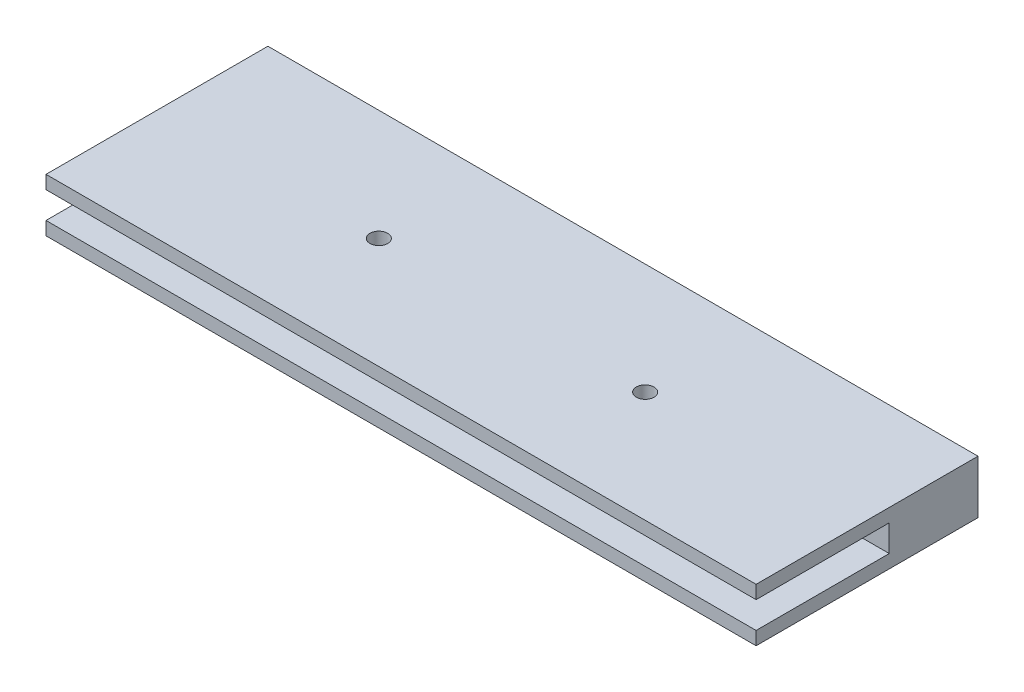
ISO-10303-21;
HEADER;
FILE_DESCRIPTION(('STEP AP214'),'2;1');
FILE_NAME('part.step','',(''),(''),'','','');
FILE_SCHEMA(('AUTOMOTIVE_DESIGN { 1 0 10303 214 1 1 1 1 }'));
ENDSEC;
DATA;
#1=APPLICATION_CONTEXT('core data for automotive mechanical design processes');
#2=APPLICATION_PROTOCOL_DEFINITION('international standard','automotive_design',2000,#1);
#3=PRODUCT_CONTEXT('',#1,'mechanical');
#4=PRODUCT('Part','Part','',(#3));
#5=PRODUCT_RELATED_PRODUCT_CATEGORY('part','',(#4));
#6=PRODUCT_DEFINITION_FORMATION('','',#4);
#7=PRODUCT_DEFINITION_CONTEXT('part definition',#1,'design');
#8=PRODUCT_DEFINITION('design','',#6,#7);
#9=PRODUCT_DEFINITION_SHAPE('','',#8);
#10=(LENGTH_UNIT() NAMED_UNIT(*) SI_UNIT(.MILLI.,.METRE.));
#11=(NAMED_UNIT(*) PLANE_ANGLE_UNIT() SI_UNIT($,.RADIAN.));
#12=(NAMED_UNIT(*) SI_UNIT($,.STERADIAN.) SOLID_ANGLE_UNIT());
#13=UNCERTAINTY_MEASURE_WITH_UNIT(LENGTH_MEASURE(1.E-05),#10,'distance_accuracy_value','');
#14=(GEOMETRIC_REPRESENTATION_CONTEXT(3) GLOBAL_UNCERTAINTY_ASSIGNED_CONTEXT((#13)) GLOBAL_UNIT_ASSIGNED_CONTEXT((#10,
#11,#12)) REPRESENTATION_CONTEXT('',''));
#15=CARTESIAN_POINT('',(0.,0.,0.));
#16=DIRECTION('',(0.,0.,1.));
#17=DIRECTION('',(1.,0.,0.));
#18=AXIS2_PLACEMENT_3D('',#15,#16,#17);
#19=CARTESIAN_POINT('',(60.,-19.,17.5));
#20=DIRECTION('',(0.,1.,0.));
#21=DIRECTION('',(0.,0.,1.));
#22=AXIS2_PLACEMENT_3D('',#19,#20,#21);
#23=CYLINDRICAL_SURFACE('',#22,0.999999999999998);
#24=CARTESIAN_POINT('',(60.,1.5,17.5));
#25=DIRECTION('',(0.,-1.,0.));
#26=DIRECTION('',(0.,0.,-1.));
#27=AXIS2_PLACEMENT_3D('',#24,#25,#26);
#28=CIRCLE('',#27,0.999999999999998);
#29=CARTESIAN_POINT('',(60.,1.5,16.5));
#30=VERTEX_POINT('',#29);
#31=EDGE_CURVE('E210',#30,#30,#28,.T.);
#32=ORIENTED_EDGE('',*,*,#31,.F.);
#33=EDGE_LOOP('',(#32));
#34=FACE_BOUND('',#33,.T.);
#35=CARTESIAN_POINT('',(60.,1.,17.5));
#36=DIRECTION('',(0.,-1.,0.));
#37=DIRECTION('',(0.,0.,-1.));
#38=AXIS2_PLACEMENT_3D('',#35,#36,#37);
#39=CIRCLE('',#38,0.999999999999998);
#40=CARTESIAN_POINT('',(60.,1.,16.5));
#41=VERTEX_POINT('',#40);
#42=EDGE_CURVE('E11',#41,#41,#39,.F.);
#43=ORIENTED_EDGE('',*,*,#42,.F.);
#44=EDGE_LOOP('',(#43));
#45=FACE_BOUND('',#44,.T.);
#46=ADVANCED_FACE('F44',(#34,#45),#23,.F.);
#47=CARTESIAN_POINT('',(20.,-19.,17.5));
#48=DIRECTION('',(0.,1.,0.));
#49=DIRECTION('',(0.,0.,1.));
#50=AXIS2_PLACEMENT_3D('',#47,#48,#49);
#51=CYLINDRICAL_SURFACE('',#50,0.999999999999998);
#52=CARTESIAN_POINT('',(20.,1.5,17.5));
#53=DIRECTION('',(0.,-1.,0.));
#54=DIRECTION('',(0.,0.,-1.));
#55=AXIS2_PLACEMENT_3D('',#52,#53,#54);
#56=CIRCLE('',#55,0.999999999999998);
#57=CARTESIAN_POINT('',(20.,1.5,16.5));
#58=VERTEX_POINT('',#57);
#59=EDGE_CURVE('E142',#58,#58,#56,.T.);
#60=ORIENTED_EDGE('',*,*,#59,.F.);
#61=EDGE_LOOP('',(#60));
#62=FACE_BOUND('',#61,.T.);
#63=CARTESIAN_POINT('',(20.,1.,17.5));
#64=DIRECTION('',(0.,-1.,0.));
#65=DIRECTION('',(0.,0.,-1.));
#66=AXIS2_PLACEMENT_3D('',#63,#64,#65);
#67=CIRCLE('',#66,0.999999999999998);
#68=CARTESIAN_POINT('',(20.,1.,16.5));
#69=VERTEX_POINT('',#68);
#70=EDGE_CURVE('E54',#69,#69,#67,.F.);
#71=ORIENTED_EDGE('',*,*,#70,.F.);
#72=EDGE_LOOP('',(#71));
#73=FACE_BOUND('',#72,.T.);
#74=ADVANCED_FACE('F269',(#62,#73),#51,.F.);
#75=CARTESIAN_POINT('',(60.,4.5,17.5));
#76=DIRECTION('',(0.,1.,0.));
#77=DIRECTION('',(0.,0.,1.));
#78=AXIS2_PLACEMENT_3D('',#75,#76,#77);
#79=CIRCLE('',#78,0.999999999999998);
#80=CARTESIAN_POINT('',(60.,4.5,18.5));
#81=VERTEX_POINT('',#80);
#82=EDGE_CURVE('E214',#81,#81,#79,.T.);
#83=ORIENTED_EDGE('',*,*,#82,.F.);
#84=EDGE_LOOP('',(#83));
#85=FACE_BOUND('',#84,.T.);
#86=CARTESIAN_POINT('',(60.,5.,17.5));
#87=DIRECTION('',(0.,1.,0.));
#88=DIRECTION('',(0.,0.,1.));
#89=AXIS2_PLACEMENT_3D('',#86,#87,#88);
#90=CIRCLE('',#89,0.999999999999998);
#91=CARTESIAN_POINT('',(60.,5.,18.5));
#92=VERTEX_POINT('',#91);
#93=EDGE_CURVE('E222',#92,#92,#90,.F.);
#94=ORIENTED_EDGE('',*,*,#93,.F.);
#95=EDGE_LOOP('',(#94));
#96=FACE_BOUND('',#95,.T.);
#97=ADVANCED_FACE('F265',(#85,#96),#23,.F.);
#98=CARTESIAN_POINT('',(20.,4.5,17.5));
#99=DIRECTION('',(0.,1.,0.));
#100=DIRECTION('',(0.,0.,1.));
#101=AXIS2_PLACEMENT_3D('',#98,#99,#100);
#102=CIRCLE('',#101,0.999999999999998);
#103=CARTESIAN_POINT('',(20.,4.5,18.5));
#104=VERTEX_POINT('',#103);
#105=EDGE_CURVE('E138',#104,#104,#102,.T.);
#106=ORIENTED_EDGE('',*,*,#105,.F.);
#107=EDGE_LOOP('',(#106));
#108=FACE_BOUND('',#107,.T.);
#109=CARTESIAN_POINT('',(20.,5.,17.5));
#110=DIRECTION('',(0.,1.,0.));
#111=DIRECTION('',(0.,0.,1.));
#112=AXIS2_PLACEMENT_3D('',#109,#110,#111);
#113=CIRCLE('',#112,0.999999999999998);
#114=CARTESIAN_POINT('',(20.,5.,18.5));
#115=VERTEX_POINT('',#114);
#116=EDGE_CURVE('E209',#115,#115,#113,.F.);
#117=ORIENTED_EDGE('',*,*,#116,.F.);
#118=EDGE_LOOP('',(#117));
#119=FACE_BOUND('',#118,.T.);
#120=ADVANCED_FACE('F268',(#108,#119),#51,.F.);
#121=CARTESIAN_POINT('',(0.,0.,10.));
#122=DIRECTION('',(1.,0.,0.));
#123=DIRECTION('',(0.,0.,-1.));
#124=AXIS2_PLACEMENT_3D('',#121,#122,#123);
#125=PLANE('',#124);
#126=DIRECTION('',(0.,0.,-1.));
#127=VECTOR('',#126,1.);
#128=CARTESIAN_POINT('',(0.,6.,10.));
#129=LINE('',#128,#127);
#130=CARTESIAN_POINT('',(0.,6.,30.));
#131=VERTEX_POINT('',#130);
#132=CARTESIAN_POINT('',(0.,6.,4.99999999999999));
#133=VERTEX_POINT('',#132);
#134=EDGE_CURVE('E62',#131,#133,#129,.T.);
#135=ORIENTED_EDGE('',*,*,#134,.T.);
#136=DIRECTION('',(0.,1.,0.));
#137=VECTOR('',#136,1.);
#138=CARTESIAN_POINT('',(0.,6.,4.99999999999999));
#139=LINE('',#138,#137);
#140=CARTESIAN_POINT('',(0.,0.,4.99999999999999));
#141=VERTEX_POINT('',#140);
#142=EDGE_CURVE('E132',#141,#133,#139,.T.);
#143=ORIENTED_EDGE('',*,*,#142,.F.);
#144=DIRECTION('',(0.,0.,-1.));
#145=VECTOR('',#144,1.);
#146=CARTESIAN_POINT('',(0.,0.,10.));
#147=LINE('',#146,#145);
#148=CARTESIAN_POINT('',(0.,0.,30.));
#149=VERTEX_POINT('',#148);
#150=EDGE_CURVE('E123',#149,#141,#147,.T.);
#151=ORIENTED_EDGE('',*,*,#150,.F.);
#152=DIRECTION('',(0.,-1.,0.));
#153=VECTOR('',#152,1.);
#154=CARTESIAN_POINT('',(0.,0.,30.));
#155=LINE('',#154,#153);
#156=CARTESIAN_POINT('',(0.,1.5,30.));
#157=VERTEX_POINT('',#156);
#158=EDGE_CURVE('E180',#157,#149,#155,.T.);
#159=ORIENTED_EDGE('',*,*,#158,.F.);
#160=DIRECTION('',(0.,0.,-1.));
#161=VECTOR('',#160,1.);
#162=CARTESIAN_POINT('',(0.,1.5,30.));
#163=LINE('',#162,#161);
#164=CARTESIAN_POINT('',(0.,1.5,15.));
#165=VERTEX_POINT('',#164);
#166=EDGE_CURVE('E169',#157,#165,#163,.T.);
#167=ORIENTED_EDGE('',*,*,#166,.T.);
#168=DIRECTION('',(0.,-1.,0.));
#169=VECTOR('',#168,1.);
#170=CARTESIAN_POINT('',(0.,4.5,15.));
#171=LINE('',#170,#169);
#172=CARTESIAN_POINT('',(0.,4.5,15.));
#173=VERTEX_POINT('',#172);
#174=EDGE_CURVE('E150',#173,#165,#171,.T.);
#175=ORIENTED_EDGE('',*,*,#174,.F.);
#176=DIRECTION('',(0.,0.,-1.));
#177=VECTOR('',#176,1.);
#178=CARTESIAN_POINT('',(0.,4.5,30.));
#179=LINE('',#178,#177);
#180=CARTESIAN_POINT('',(0.,4.5,30.));
#181=VERTEX_POINT('',#180);
#182=EDGE_CURVE('E200',#181,#173,#179,.T.);
#183=ORIENTED_EDGE('',*,*,#182,.F.);
#184=DIRECTION('',(0.,-1.,0.));
#185=VECTOR('',#184,1.);
#186=CARTESIAN_POINT('',(0.,6.,30.));
#187=LINE('',#186,#185);
#188=EDGE_CURVE('E184',#131,#181,#187,.T.);
#189=ORIENTED_EDGE('',*,*,#188,.F.);
#190=EDGE_LOOP('',(#135,#143,#151,#159,#167,#175,#183,#189));
#191=FACE_BOUND('',#190,.T.);
#192=ADVANCED_FACE('F46',(#191),#125,.F.);
#193=CARTESIAN_POINT('',(80.,0.,10.));
#194=DIRECTION('',(-1.,0.,0.));
#195=DIRECTION('',(0.,0.,1.));
#196=AXIS2_PLACEMENT_3D('',#193,#194,#195);
#197=PLANE('',#196);
#198=DIRECTION('',(0.,0.,-1.));
#199=VECTOR('',#198,1.);
#200=CARTESIAN_POINT('',(80.,0.,10.));
#201=LINE('',#200,#199);
#202=CARTESIAN_POINT('',(80.,0.,30.));
#203=VERTEX_POINT('',#202);
#204=CARTESIAN_POINT('',(80.,0.,4.99999999999999));
#205=VERTEX_POINT('',#204);
#206=EDGE_CURVE('E112',#203,#205,#201,.T.);
#207=ORIENTED_EDGE('',*,*,#206,.T.);
#208=DIRECTION('',(0.,-1.,0.));
#209=VECTOR('',#208,1.);
#210=CARTESIAN_POINT('',(80.,6.,4.99999999999999));
#211=LINE('',#210,#209);
#212=CARTESIAN_POINT('',(80.,6.,4.99999999999999));
#213=VERTEX_POINT('',#212);
#214=EDGE_CURVE('E116',#213,#205,#211,.T.);
#215=ORIENTED_EDGE('',*,*,#214,.F.);
#216=DIRECTION('',(0.,0.,-1.));
#217=VECTOR('',#216,1.);
#218=CARTESIAN_POINT('',(80.,6.,10.));
#219=LINE('',#218,#217);
#220=CARTESIAN_POINT('',(80.,6.,30.));
#221=VERTEX_POINT('',#220);
#222=EDGE_CURVE('E70',#221,#213,#219,.T.);
#223=ORIENTED_EDGE('',*,*,#222,.F.);
#224=DIRECTION('',(0.,1.,0.));
#225=VECTOR('',#224,1.);
#226=CARTESIAN_POINT('',(80.,6.,30.));
#227=LINE('',#226,#225);
#228=CARTESIAN_POINT('',(80.,4.5,30.));
#229=VERTEX_POINT('',#228);
#230=EDGE_CURVE('E191',#229,#221,#227,.T.);
#231=ORIENTED_EDGE('',*,*,#230,.F.);
#232=DIRECTION('',(0.,0.,-1.));
#233=VECTOR('',#232,1.);
#234=CARTESIAN_POINT('',(80.,4.5,30.));
#235=LINE('',#234,#233);
#236=CARTESIAN_POINT('',(80.,4.5,15.));
#237=VERTEX_POINT('',#236);
#238=EDGE_CURVE('E197',#229,#237,#235,.T.);
#239=ORIENTED_EDGE('',*,*,#238,.T.);
#240=DIRECTION('',(0.,-1.,0.));
#241=VECTOR('',#240,1.);
#242=CARTESIAN_POINT('',(80.,4.5,15.));
#243=LINE('',#242,#241);
#244=CARTESIAN_POINT('',(80.,1.5,15.));
#245=VERTEX_POINT('',#244);
#246=EDGE_CURVE('E151',#237,#245,#243,.T.);
#247=ORIENTED_EDGE('',*,*,#246,.T.);
#248=DIRECTION('',(0.,0.,-1.));
#249=VECTOR('',#248,1.);
#250=CARTESIAN_POINT('',(80.,1.5,30.));
#251=LINE('',#250,#249);
#252=CARTESIAN_POINT('',(80.,1.5,30.));
#253=VERTEX_POINT('',#252);
#254=EDGE_CURVE('E166',#253,#245,#251,.T.);
#255=ORIENTED_EDGE('',*,*,#254,.F.);
#256=DIRECTION('',(0.,1.,0.));
#257=VECTOR('',#256,1.);
#258=CARTESIAN_POINT('',(80.,0.,30.));
#259=LINE('',#258,#257);
#260=EDGE_CURVE('E118',#203,#253,#259,.T.);
#261=ORIENTED_EDGE('',*,*,#260,.F.);
#262=EDGE_LOOP('',(#207,#215,#223,#231,#239,#247,#255,#261));
#263=FACE_BOUND('',#262,.T.);
#264=ADVANCED_FACE('F114',(#263),#197,.F.);
#265=CARTESIAN_POINT('',(0.,0.,10.));
#266=DIRECTION('',(0.,1.,0.));
#267=DIRECTION('',(0.,0.,1.));
#268=AXIS2_PLACEMENT_3D('',#265,#266,#267);
#269=PLANE('',#268);
#270=CARTESIAN_POINT('',(25.,0.,17.5));
#271=DIRECTION('',(0.,1.,0.));
#272=DIRECTION('',(0.,0.,1.));
#273=AXIS2_PLACEMENT_3D('',#270,#271,#272);
#274=CIRCLE('',#273,1.);
#275=CARTESIAN_POINT('',(25.,0.,16.5));
#276=VERTEX_POINT('',#275);
#277=EDGE_CURVE('E215',#276,#276,#274,.F.);
#278=ORIENTED_EDGE('',*,*,#277,.F.);
#279=EDGE_LOOP('',(#278));
#280=FACE_BOUND('',#279,.T.);
#281=CARTESIAN_POINT('',(55.,0.,17.5));
#282=DIRECTION('',(0.,1.,0.));
#283=DIRECTION('',(0.,0.,1.));
#284=AXIS2_PLACEMENT_3D('',#281,#282,#283);
#285=CIRCLE('',#284,0.999999999999998);
#286=CARTESIAN_POINT('',(55.,0.,16.5));
#287=VERTEX_POINT('',#286);
#288=EDGE_CURVE('E242',#287,#287,#285,.F.);
#289=ORIENTED_EDGE('',*,*,#288,.F.);
#290=EDGE_LOOP('',(#289));
#291=FACE_BOUND('',#290,.T.);
#292=ORIENTED_EDGE('',*,*,#150,.T.);
#293=DIRECTION('',(-1.,0.,0.));
#294=VECTOR('',#293,1.);
#295=CARTESIAN_POINT('',(80.,0.,4.99999999999999));
#296=LINE('',#295,#294);
#297=EDGE_CURVE('E126',#205,#141,#296,.T.);
#298=ORIENTED_EDGE('',*,*,#297,.F.);
#299=ORIENTED_EDGE('',*,*,#206,.F.);
#300=DIRECTION('',(1.,0.,0.));
#301=VECTOR('',#300,1.);
#302=CARTESIAN_POINT('',(0.,0.,30.));
#303=LINE('',#302,#301);
#304=EDGE_CURVE('E177',#149,#203,#303,.T.);
#305=ORIENTED_EDGE('',*,*,#304,.F.);
#306=EDGE_LOOP('',(#292,#298,#299,#305));
#307=FACE_BOUND('',#306,.T.);
#308=ADVANCED_FACE('F127',(#280,#291,#307),#269,.F.);
#309=CARTESIAN_POINT('',(0.,6.,10.));
#310=DIRECTION('',(0.,-1.,0.));
#311=DIRECTION('',(0.,0.,-1.));
#312=AXIS2_PLACEMENT_3D('',#309,#310,#311);
#313=PLANE('',#312);
#314=CARTESIAN_POINT('',(25.,6.,17.5));
#315=DIRECTION('',(0.,-1.,0.));
#316=DIRECTION('',(0.,0.,-1.));
#317=AXIS2_PLACEMENT_3D('',#314,#315,#316);
#318=CIRCLE('',#317,1.);
#319=CARTESIAN_POINT('',(25.,6.,16.5));
#320=VERTEX_POINT('',#319);
#321=EDGE_CURVE('E252',#320,#320,#318,.F.);
#322=ORIENTED_EDGE('',*,*,#321,.F.);
#323=EDGE_LOOP('',(#322));
#324=FACE_BOUND('',#323,.T.);
#325=CARTESIAN_POINT('',(55.,6.,17.5));
#326=DIRECTION('',(0.,-1.,0.));
#327=DIRECTION('',(0.,0.,-1.));
#328=AXIS2_PLACEMENT_3D('',#325,#326,#327);
#329=CIRCLE('',#328,0.999999999999998);
#330=CARTESIAN_POINT('',(55.,6.,16.5));
#331=VERTEX_POINT('',#330);
#332=EDGE_CURVE('E236',#331,#331,#329,.F.);
#333=ORIENTED_EDGE('',*,*,#332,.F.);
#334=EDGE_LOOP('',(#333));
#335=FACE_BOUND('',#334,.T.);
#336=ORIENTED_EDGE('',*,*,#222,.T.);
#337=DIRECTION('',(1.,0.,0.));
#338=VECTOR('',#337,1.);
#339=CARTESIAN_POINT('',(80.,6.,4.99999999999999));
#340=LINE('',#339,#338);
#341=EDGE_CURVE('E136',#133,#213,#340,.T.);
#342=ORIENTED_EDGE('',*,*,#341,.F.);
#343=ORIENTED_EDGE('',*,*,#134,.F.);
#344=DIRECTION('',(-1.,0.,0.));
#345=VECTOR('',#344,1.);
#346=CARTESIAN_POINT('',(0.,6.,30.));
#347=LINE('',#346,#345);
#348=EDGE_CURVE('E194',#221,#131,#347,.T.);
#349=ORIENTED_EDGE('',*,*,#348,.F.);
#350=EDGE_LOOP('',(#336,#342,#343,#349));
#351=FACE_BOUND('',#350,.T.);
#352=ADVANCED_FACE('F317',(#324,#335,#351),#313,.F.);
#353=CARTESIAN_POINT('',(0.,4.5,30.));
#354=DIRECTION('',(0.,1.,0.));
#355=DIRECTION('',(0.,0.,1.));
#356=AXIS2_PLACEMENT_3D('',#353,#354,#355);
#357=PLANE('',#356);
#358=CARTESIAN_POINT('',(25.,4.5,17.5));
#359=DIRECTION('',(0.,1.,0.));
#360=DIRECTION('',(0.,0.,1.));
#361=AXIS2_PLACEMENT_3D('',#358,#359,#360);
#362=CIRCLE('',#361,1.);
#363=CARTESIAN_POINT('',(25.,4.5,16.5));
#364=VERTEX_POINT('',#363);
#365=EDGE_CURVE('E248',#364,#364,#362,.F.);
#366=ORIENTED_EDGE('',*,*,#365,.F.);
#367=EDGE_LOOP('',(#366));
#368=FACE_BOUND('',#367,.T.);
#369=CARTESIAN_POINT('',(55.,4.5,17.5));
#370=DIRECTION('',(0.,1.,0.));
#371=DIRECTION('',(0.,0.,1.));
#372=AXIS2_PLACEMENT_3D('',#369,#370,#371);
#373=CIRCLE('',#372,0.999999999999998);
#374=CARTESIAN_POINT('',(55.,4.5,16.5));
#375=VERTEX_POINT('',#374);
#376=EDGE_CURVE('E231',#375,#375,#373,.F.);
#377=ORIENTED_EDGE('',*,*,#376,.F.);
#378=EDGE_LOOP('',(#377));
#379=FACE_BOUND('',#378,.T.);
#380=ORIENTED_EDGE('',*,*,#105,.T.);
#381=EDGE_LOOP('',(#380));
#382=FACE_BOUND('',#381,.T.);
#383=ORIENTED_EDGE('',*,*,#82,.T.);
#384=EDGE_LOOP('',(#383));
#385=FACE_BOUND('',#384,.T.);
#386=ORIENTED_EDGE('',*,*,#182,.T.);
#387=DIRECTION('',(-1.,0.,0.));
#388=VECTOR('',#387,1.);
#389=CARTESIAN_POINT('',(80.,4.5,15.));
#390=LINE('',#389,#388);
#391=EDGE_CURVE('E155',#237,#173,#390,.T.);
#392=ORIENTED_EDGE('',*,*,#391,.F.);
#393=ORIENTED_EDGE('',*,*,#238,.F.);
#394=DIRECTION('',(1.,0.,0.));
#395=VECTOR('',#394,1.);
#396=CARTESIAN_POINT('',(0.,4.5,30.));
#397=LINE('',#396,#395);
#398=EDGE_CURVE('E188',#181,#229,#397,.T.);
#399=ORIENTED_EDGE('',*,*,#398,.F.);
#400=EDGE_LOOP('',(#386,#392,#393,#399));
#401=FACE_BOUND('',#400,.T.);
#402=ADVANCED_FACE('F262',(#368,#379,#382,#385,#401),#357,.F.);
#403=CARTESIAN_POINT('',(0.,0.,30.));
#404=DIRECTION('',(0.,0.,1.));
#405=DIRECTION('',(1.,0.,0.));
#406=AXIS2_PLACEMENT_3D('',#403,#404,#405);
#407=PLANE('',#406);
#408=ORIENTED_EDGE('',*,*,#188,.T.);
#409=ORIENTED_EDGE('',*,*,#398,.T.);
#410=ORIENTED_EDGE('',*,*,#230,.T.);
#411=ORIENTED_EDGE('',*,*,#348,.T.);
#412=EDGE_LOOP('',(#408,#409,#410,#411));
#413=FACE_BOUND('',#412,.T.);
#414=ADVANCED_FACE('F307',(#413),#407,.T.);
#415=CARTESIAN_POINT('',(0.,1.5,30.));
#416=DIRECTION('',(0.,-1.,0.));
#417=DIRECTION('',(0.,0.,-1.));
#418=AXIS2_PLACEMENT_3D('',#415,#416,#417);
#419=PLANE('',#418);
#420=CARTESIAN_POINT('',(25.,1.5,17.5));
#421=DIRECTION('',(0.,-1.,0.));
#422=DIRECTION('',(0.,0.,-1.));
#423=AXIS2_PLACEMENT_3D('',#420,#421,#422);
#424=CIRCLE('',#423,1.);
#425=CARTESIAN_POINT('',(25.,1.5,16.5));
#426=VERTEX_POINT('',#425);
#427=EDGE_CURVE('E48',#426,#426,#424,.F.);
#428=ORIENTED_EDGE('',*,*,#427,.F.);
#429=EDGE_LOOP('',(#428));
#430=FACE_BOUND('',#429,.T.);
#431=CARTESIAN_POINT('',(55.,1.5,17.5));
#432=DIRECTION('',(0.,-1.,0.));
#433=DIRECTION('',(0.,0.,-1.));
#434=AXIS2_PLACEMENT_3D('',#431,#432,#433);
#435=CIRCLE('',#434,0.999999999999998);
#436=CARTESIAN_POINT('',(55.,1.5,16.5));
#437=VERTEX_POINT('',#436);
#438=EDGE_CURVE('E228',#437,#437,#435,.F.);
#439=ORIENTED_EDGE('',*,*,#438,.F.);
#440=EDGE_LOOP('',(#439));
#441=FACE_BOUND('',#440,.T.);
#442=ORIENTED_EDGE('',*,*,#59,.T.);
#443=EDGE_LOOP('',(#442));
#444=FACE_BOUND('',#443,.T.);
#445=ORIENTED_EDGE('',*,*,#31,.T.);
#446=EDGE_LOOP('',(#445));
#447=FACE_BOUND('',#446,.T.);
#448=ORIENTED_EDGE('',*,*,#254,.T.);
#449=DIRECTION('',(-1.,0.,0.));
#450=VECTOR('',#449,1.);
#451=CARTESIAN_POINT('',(80.,1.5,15.));
#452=LINE('',#451,#450);
#453=EDGE_CURVE('E162',#245,#165,#452,.T.);
#454=ORIENTED_EDGE('',*,*,#453,.T.);
#455=ORIENTED_EDGE('',*,*,#166,.F.);
#456=DIRECTION('',(-1.,0.,0.));
#457=VECTOR('',#456,1.);
#458=CARTESIAN_POINT('',(0.,1.5,30.));
#459=LINE('',#458,#457);
#460=EDGE_CURVE('E172',#253,#157,#459,.T.);
#461=ORIENTED_EDGE('',*,*,#460,.F.);
#462=EDGE_LOOP('',(#448,#454,#455,#461));
#463=FACE_BOUND('',#462,.T.);
#464=ADVANCED_FACE('F304',(#430,#441,#444,#447,#463),#419,.F.);
#465=CARTESIAN_POINT('',(0.,0.,30.));
#466=DIRECTION('',(0.,0.,-1.));
#467=DIRECTION('',(-1.,0.,0.));
#468=AXIS2_PLACEMENT_3D('',#465,#466,#467);
#469=PLANE('',#468);
#470=ORIENTED_EDGE('',*,*,#158,.T.);
#471=ORIENTED_EDGE('',*,*,#304,.T.);
#472=ORIENTED_EDGE('',*,*,#260,.T.);
#473=ORIENTED_EDGE('',*,*,#460,.T.);
#474=EDGE_LOOP('',(#470,#471,#472,#473));
#475=FACE_BOUND('',#474,.T.);
#476=ADVANCED_FACE('F302',(#475),#469,.F.);
#477=CARTESIAN_POINT('',(80.,4.5,15.));
#478=DIRECTION('',(0.,0.,-1.));
#479=DIRECTION('',(-1.,0.,0.));
#480=AXIS2_PLACEMENT_3D('',#477,#478,#479);
#481=PLANE('',#480);
#482=ORIENTED_EDGE('',*,*,#174,.T.);
#483=ORIENTED_EDGE('',*,*,#453,.F.);
#484=ORIENTED_EDGE('',*,*,#246,.F.);
#485=ORIENTED_EDGE('',*,*,#391,.T.);
#486=EDGE_LOOP('',(#482,#483,#484,#485));
#487=FACE_BOUND('',#486,.T.);
#488=ADVANCED_FACE('F299',(#487),#481,.F.);
#489=CARTESIAN_POINT('',(0.,0.,4.99999999999999));
#490=DIRECTION('',(0.,0.,-1.));
#491=DIRECTION('',(-1.,0.,0.));
#492=AXIS2_PLACEMENT_3D('',#489,#490,#491);
#493=PLANE('',#492);
#494=ORIENTED_EDGE('',*,*,#214,.T.);
#495=ORIENTED_EDGE('',*,*,#297,.T.);
#496=ORIENTED_EDGE('',*,*,#142,.T.);
#497=ORIENTED_EDGE('',*,*,#341,.T.);
#498=EDGE_LOOP('',(#494,#495,#496,#497));
#499=FACE_BOUND('',#498,.T.);
#500=ADVANCED_FACE('F135',(#499),#493,.T.);
#501=CARTESIAN_POINT('',(20.,5.,17.5));
#502=DIRECTION('',(0.,1.,0.));
#503=DIRECTION('',(0.,0.,1.));
#504=AXIS2_PLACEMENT_3D('',#501,#502,#503);
#505=PLANE('',#504);
#506=ORIENTED_EDGE('',*,*,#116,.T.);
#507=EDGE_LOOP('',(#506));
#508=FACE_BOUND('',#507,.T.);
#509=ADVANCED_FACE('F276',(#508),#505,.F.);
#510=CARTESIAN_POINT('',(60.,5.,17.5));
#511=DIRECTION('',(0.,1.,0.));
#512=DIRECTION('',(0.,0.,1.));
#513=AXIS2_PLACEMENT_3D('',#510,#511,#512);
#514=PLANE('',#513);
#515=ORIENTED_EDGE('',*,*,#93,.T.);
#516=EDGE_LOOP('',(#515));
#517=FACE_BOUND('',#516,.T.);
#518=ADVANCED_FACE('F273',(#517),#514,.F.);
#519=CARTESIAN_POINT('',(20.,1.,17.5));
#520=DIRECTION('',(0.,-1.,0.));
#521=DIRECTION('',(0.,0.,-1.));
#522=AXIS2_PLACEMENT_3D('',#519,#520,#521);
#523=PLANE('',#522);
#524=ORIENTED_EDGE('',*,*,#70,.T.);
#525=EDGE_LOOP('',(#524));
#526=FACE_BOUND('',#525,.T.);
#527=ADVANCED_FACE('F275',(#526),#523,.F.);
#528=CARTESIAN_POINT('',(60.,1.,17.5));
#529=DIRECTION('',(0.,-1.,0.));
#530=DIRECTION('',(0.,0.,-1.));
#531=AXIS2_PLACEMENT_3D('',#528,#529,#530);
#532=PLANE('',#531);
#533=ORIENTED_EDGE('',*,*,#42,.T.);
#534=EDGE_LOOP('',(#533));
#535=FACE_BOUND('',#534,.T.);
#536=ADVANCED_FACE('F283',(#535),#532,.F.);
#537=CARTESIAN_POINT('',(55.,6.000012,17.5));
#538=DIRECTION('',(0.,-1.,0.));
#539=DIRECTION('',(0.,0.,-1.));
#540=AXIS2_PLACEMENT_3D('',#537,#538,#539);
#541=CYLINDRICAL_SURFACE('',#540,0.999999999999998);
#542=CARTESIAN_POINT('',(55.,1.5,16.5));
#543=CARTESIAN_POINT('',(55.,1.484375,16.5));
#544=CARTESIAN_POINT('',(55.,1.46875,16.5));
#545=CARTESIAN_POINT('',(55.,1.4375,16.5));
#546=CARTESIAN_POINT('',(55.,1.421875,16.5));
#547=CARTESIAN_POINT('',(55.,1.390625,16.5));
#548=CARTESIAN_POINT('',(55.,1.375,16.5));
#549=CARTESIAN_POINT('',(55.,1.34375,16.5));
#550=CARTESIAN_POINT('',(55.,1.328125,16.5));
#551=CARTESIAN_POINT('',(55.,1.296875,16.5));
#552=CARTESIAN_POINT('',(55.,1.28125,16.5));
#553=CARTESIAN_POINT('',(55.,1.25,16.5));
#554=CARTESIAN_POINT('',(55.,1.234375,16.5));
#555=CARTESIAN_POINT('',(55.,1.203125,16.5));
#556=CARTESIAN_POINT('',(55.,1.1875,16.5));
#557=CARTESIAN_POINT('',(55.,1.15625,16.5));
#558=CARTESIAN_POINT('',(55.,1.140625,16.5));
#559=CARTESIAN_POINT('',(55.,1.109375,16.5));
#560=CARTESIAN_POINT('',(55.,1.09375,16.5));
#561=CARTESIAN_POINT('',(55.,1.0625,16.5));
#562=CARTESIAN_POINT('',(55.,1.046875,16.5));
#563=CARTESIAN_POINT('',(55.,1.015625,16.5));
#564=CARTESIAN_POINT('',(55.,1.,16.5));
#565=CARTESIAN_POINT('',(55.,0.968750000000001,16.5));
#566=CARTESIAN_POINT('',(55.,0.953125000000001,16.5));
#567=CARTESIAN_POINT('',(55.,0.921875000000001,16.5));
#568=CARTESIAN_POINT('',(55.,0.906250000000001,16.5));
#569=CARTESIAN_POINT('',(55.,0.875000000000001,16.5));
#570=CARTESIAN_POINT('',(55.,0.859375000000001,16.5));
#571=CARTESIAN_POINT('',(55.,0.828125000000001,16.5));
#572=CARTESIAN_POINT('',(55.,0.812500000000001,16.5));
#573=CARTESIAN_POINT('',(55.,0.781250000000001,16.5));
#574=CARTESIAN_POINT('',(55.,0.765625000000001,16.5));
#575=CARTESIAN_POINT('',(55.,0.734375000000001,16.5));
#576=CARTESIAN_POINT('',(55.,0.718750000000001,16.5));
#577=CARTESIAN_POINT('',(55.,0.687500000000001,16.5));
#578=CARTESIAN_POINT('',(55.,0.671875000000001,16.5));
#579=CARTESIAN_POINT('',(55.,0.640625000000001,16.5));
#580=CARTESIAN_POINT('',(55.,0.625000000000001,16.5));
#581=CARTESIAN_POINT('',(55.,0.593750000000001,16.5));
#582=CARTESIAN_POINT('',(55.,0.578125000000001,16.5));
#583=CARTESIAN_POINT('',(55.,0.546875,16.5));
#584=CARTESIAN_POINT('',(55.,0.53125,16.5));
#585=CARTESIAN_POINT('',(55.,0.5,16.5));
#586=CARTESIAN_POINT('',(55.,0.484375,16.5));
#587=CARTESIAN_POINT('',(55.,0.453125,16.5));
#588=CARTESIAN_POINT('',(55.,0.4375,16.5));
#589=CARTESIAN_POINT('',(55.,0.40625,16.5));
#590=CARTESIAN_POINT('',(55.,0.390625,16.5));
#591=CARTESIAN_POINT('',(55.,0.359375,16.5));
#592=CARTESIAN_POINT('',(55.,0.34375,16.5));
#593=CARTESIAN_POINT('',(55.,0.3125,16.5));
#594=CARTESIAN_POINT('',(55.,0.296875,16.5));
#595=CARTESIAN_POINT('',(55.,0.265625,16.5));
#596=CARTESIAN_POINT('',(55.,0.25,16.5));
#597=CARTESIAN_POINT('',(55.,0.21875,16.5));
#598=CARTESIAN_POINT('',(55.,0.203125,16.5));
#599=CARTESIAN_POINT('',(55.,0.171875,16.5));
#600=CARTESIAN_POINT('',(55.,0.15625,16.5));
#601=CARTESIAN_POINT('',(55.,0.125,16.5));
#602=CARTESIAN_POINT('',(55.,0.109375,16.5));
#603=CARTESIAN_POINT('',(55.,0.0781250000000001,16.5));
#604=CARTESIAN_POINT('',(55.,0.0625000000000001,16.5));
#605=CARTESIAN_POINT('',(55.,0.03125,16.5));
#606=CARTESIAN_POINT('',(55.,0.015625,16.5));
#607=CARTESIAN_POINT('',(55.,0.,16.5));
#608=B_SPLINE_CURVE_WITH_KNOTS('',3,(#542,#543,#544,#545,#546,#547,#548,#549,#550,#551,#552,
#553,#554,#555,#556,#557,#558,#559,#560,#561,#562,#563,#564,#565,#566,#567,#568,#569,#570,#571,
#572,#573,#574,#575,#576,#577,#578,#579,#580,#581,#582,#583,#584,#585,#586,#587,#588,#589,#590,
#591,#592,#593,#594,#595,#596,#597,#598,#599,#600,#601,#602,#603,#604,#605,#606,#607),
.UNSPECIFIED.,.F.,.F.,(4,2,2,2,2,2,2,2,2,2,2,2,2,2,2,2,2,2,2,2,2,2,2,2,2,2,2,2,2,2,2,2,4),(0.,
0.046875,0.0937500000000001,0.140625,0.1875,0.234375,0.28125,0.328125,0.375,0.421875,0.46875,
0.515625,0.5625,0.609375000000001,0.656250000000001,0.703125000000001,0.750000000000001,
0.796875000000001,0.843750000000001,0.890625000000001,0.937500000000001,0.984375000000001,
1.03125,1.078125,1.125,1.171875,1.21875,1.265625,1.3125,1.359375,1.40625,1.453125,1.5),.UNSPECIFIED.);
#609=EDGE_CURVE('BSEAM332',#437,#287,#608,.T.);
#610=ORIENTED_EDGE('',*,*,#438,.T.);
#611=ORIENTED_EDGE('',*,*,#288,.T.);
#612=ORIENTED_EDGE('',*,*,#609,.T.);
#613=ORIENTED_EDGE('',*,*,#609,.F.);
#614=EDGE_LOOP('',(#610,#612,#611,#613));
#615=FACE_BOUND('',#614,.T.);
#616=ADVANCED_FACE('F332',(#615),#541,.F.);
#617=CARTESIAN_POINT('',(25.,6.000012,17.5));
#618=DIRECTION('',(0.,-1.,0.));
#619=DIRECTION('',(0.,0.,-1.));
#620=AXIS2_PLACEMENT_3D('',#617,#618,#619);
#621=CYLINDRICAL_SURFACE('',#620,1.);
#622=CARTESIAN_POINT('',(25.,1.5,16.5));
#623=CARTESIAN_POINT('',(25.,1.484375,16.5));
#624=CARTESIAN_POINT('',(25.,1.46875,16.5));
#625=CARTESIAN_POINT('',(25.,1.4375,16.5));
#626=CARTESIAN_POINT('',(25.,1.421875,16.5));
#627=CARTESIAN_POINT('',(25.,1.390625,16.5));
#628=CARTESIAN_POINT('',(25.,1.375,16.5));
#629=CARTESIAN_POINT('',(25.,1.34375,16.5));
#630=CARTESIAN_POINT('',(25.,1.328125,16.5));
#631=CARTESIAN_POINT('',(25.,1.296875,16.5));
#632=CARTESIAN_POINT('',(25.,1.28125,16.5));
#633=CARTESIAN_POINT('',(25.,1.25,16.5));
#634=CARTESIAN_POINT('',(25.,1.234375,16.5));
#635=CARTESIAN_POINT('',(25.,1.203125,16.5));
#636=CARTESIAN_POINT('',(25.,1.1875,16.5));
#637=CARTESIAN_POINT('',(25.,1.15625,16.5));
#638=CARTESIAN_POINT('',(25.,1.140625,16.5));
#639=CARTESIAN_POINT('',(25.,1.109375,16.5));
#640=CARTESIAN_POINT('',(25.,1.09375,16.5));
#641=CARTESIAN_POINT('',(25.,1.0625,16.5));
#642=CARTESIAN_POINT('',(25.,1.046875,16.5));
#643=CARTESIAN_POINT('',(25.,1.015625,16.5));
#644=CARTESIAN_POINT('',(25.,1.,16.5));
#645=CARTESIAN_POINT('',(25.,0.968750000000001,16.5));
#646=CARTESIAN_POINT('',(25.,0.953125000000001,16.5));
#647=CARTESIAN_POINT('',(25.,0.921875000000001,16.5));
#648=CARTESIAN_POINT('',(25.,0.906250000000001,16.5));
#649=CARTESIAN_POINT('',(25.,0.875000000000001,16.5));
#650=CARTESIAN_POINT('',(25.,0.859375000000001,16.5));
#651=CARTESIAN_POINT('',(25.,0.828125000000001,16.5));
#652=CARTESIAN_POINT('',(25.,0.812500000000001,16.5));
#653=CARTESIAN_POINT('',(25.,0.781250000000001,16.5));
#654=CARTESIAN_POINT('',(25.,0.765625000000001,16.5));
#655=CARTESIAN_POINT('',(25.,0.734375000000001,16.5));
#656=CARTESIAN_POINT('',(25.,0.718750000000001,16.5));
#657=CARTESIAN_POINT('',(25.,0.687500000000001,16.5));
#658=CARTESIAN_POINT('',(25.,0.671875000000001,16.5));
#659=CARTESIAN_POINT('',(25.,0.640625000000001,16.5));
#660=CARTESIAN_POINT('',(25.,0.625000000000001,16.5));
#661=CARTESIAN_POINT('',(25.,0.593750000000001,16.5));
#662=CARTESIAN_POINT('',(25.,0.578125000000001,16.5));
#663=CARTESIAN_POINT('',(25.,0.546875,16.5));
#664=CARTESIAN_POINT('',(25.,0.53125,16.5));
#665=CARTESIAN_POINT('',(25.,0.5,16.5));
#666=CARTESIAN_POINT('',(25.,0.484375,16.5));
#667=CARTESIAN_POINT('',(25.,0.453125,16.5));
#668=CARTESIAN_POINT('',(25.,0.4375,16.5));
#669=CARTESIAN_POINT('',(25.,0.40625,16.5));
#670=CARTESIAN_POINT('',(25.,0.390625,16.5));
#671=CARTESIAN_POINT('',(25.,0.359375,16.5));
#672=CARTESIAN_POINT('',(25.,0.34375,16.5));
#673=CARTESIAN_POINT('',(25.,0.3125,16.5));
#674=CARTESIAN_POINT('',(25.,0.296875,16.5));
#675=CARTESIAN_POINT('',(25.,0.265625,16.5));
#676=CARTESIAN_POINT('',(25.,0.25,16.5));
#677=CARTESIAN_POINT('',(25.,0.21875,16.5));
#678=CARTESIAN_POINT('',(25.,0.203125,16.5));
#679=CARTESIAN_POINT('',(25.,0.171875,16.5));
#680=CARTESIAN_POINT('',(25.,0.15625,16.5));
#681=CARTESIAN_POINT('',(25.,0.125,16.5));
#682=CARTESIAN_POINT('',(25.,0.109375,16.5));
#683=CARTESIAN_POINT('',(25.,0.0781250000000001,16.5));
#684=CARTESIAN_POINT('',(25.,0.0625000000000001,16.5));
#685=CARTESIAN_POINT('',(25.,0.03125,16.5));
#686=CARTESIAN_POINT('',(25.,0.015625,16.5));
#687=CARTESIAN_POINT('',(25.,0.,16.5));
#688=B_SPLINE_CURVE_WITH_KNOTS('',3,(#622,#623,#624,#625,#626,#627,#628,#629,#630,#631,#632,
#633,#634,#635,#636,#637,#638,#639,#640,#641,#642,#643,#644,#645,#646,#647,#648,#649,#650,#651,
#652,#653,#654,#655,#656,#657,#658,#659,#660,#661,#662,#663,#664,#665,#666,#667,#668,#669,#670,
#671,#672,#673,#674,#675,#676,#677,#678,#679,#680,#681,#682,#683,#684,#685,#686,#687),
.UNSPECIFIED.,.F.,.F.,(4,2,2,2,2,2,2,2,2,2,2,2,2,2,2,2,2,2,2,2,2,2,2,2,2,2,2,2,2,2,2,2,4),(0.,
0.046875,0.0937500000000001,0.140625,0.1875,0.234375,0.28125,0.328125,0.375,0.421875,0.46875,
0.515625,0.5625,0.609375000000001,0.656250000000001,0.703125000000001,0.750000000000001,
0.796875000000001,0.843750000000001,0.890625000000001,0.937500000000001,0.984375000000001,
1.03125,1.078125,1.125,1.171875,1.21875,1.265625,1.3125,1.359375,1.40625,1.453125,1.5),.UNSPECIFIED.);
#689=EDGE_CURVE('BSEAM334',#426,#276,#688,.T.);
#690=ORIENTED_EDGE('',*,*,#427,.T.);
#691=ORIENTED_EDGE('',*,*,#277,.T.);
#692=ORIENTED_EDGE('',*,*,#689,.T.);
#693=ORIENTED_EDGE('',*,*,#689,.F.);
#694=EDGE_LOOP('',(#690,#692,#691,#693));
#695=FACE_BOUND('',#694,.T.);
#696=ADVANCED_FACE('F334',(#695),#621,.F.);
#697=CARTESIAN_POINT('',(55.,4.5,16.5));
#698=CARTESIAN_POINT('',(55.,4.515625,16.5));
#699=CARTESIAN_POINT('',(55.,4.53125,16.5));
#700=CARTESIAN_POINT('',(55.,4.5625,16.5));
#701=CARTESIAN_POINT('',(55.,4.578125,16.5));
#702=CARTESIAN_POINT('',(55.,4.609375,16.5));
#703=CARTESIAN_POINT('',(55.,4.625,16.5));
#704=CARTESIAN_POINT('',(55.,4.65625,16.5));
#705=CARTESIAN_POINT('',(55.,4.671875,16.5));
#706=CARTESIAN_POINT('',(55.,4.703125,16.5));
#707=CARTESIAN_POINT('',(55.,4.71875,16.5));
#708=CARTESIAN_POINT('',(55.,4.75,16.5));
#709=CARTESIAN_POINT('',(55.,4.765625,16.5));
#710=CARTESIAN_POINT('',(55.,4.796875,16.5));
#711=CARTESIAN_POINT('',(55.,4.8125,16.5));
#712=CARTESIAN_POINT('',(55.,4.84375,16.5));
#713=CARTESIAN_POINT('',(55.,4.859375,16.5));
#714=CARTESIAN_POINT('',(55.,4.890625,16.5));
#715=CARTESIAN_POINT('',(55.,4.90625,16.5));
#716=CARTESIAN_POINT('',(55.,4.9375,16.5));
#717=CARTESIAN_POINT('',(55.,4.953125,16.5));
#718=CARTESIAN_POINT('',(55.,4.984375,16.5));
#719=CARTESIAN_POINT('',(55.,5.,16.5));
#720=CARTESIAN_POINT('',(55.,5.03125,16.5));
#721=CARTESIAN_POINT('',(55.,5.046875,16.5));
#722=CARTESIAN_POINT('',(55.,5.078125,16.5));
#723=CARTESIAN_POINT('',(55.,5.09375,16.5));
#724=CARTESIAN_POINT('',(55.,5.125,16.5));
#725=CARTESIAN_POINT('',(55.,5.140625,16.5));
#726=CARTESIAN_POINT('',(55.,5.171875,16.5));
#727=CARTESIAN_POINT('',(55.,5.1875,16.5));
#728=CARTESIAN_POINT('',(55.,5.21875,16.5));
#729=CARTESIAN_POINT('',(55.,5.234375,16.5));
#730=CARTESIAN_POINT('',(55.,5.265625,16.5));
#731=CARTESIAN_POINT('',(55.,5.28125,16.5));
#732=CARTESIAN_POINT('',(55.,5.3125,16.5));
#733=CARTESIAN_POINT('',(55.,5.328125,16.5));
#734=CARTESIAN_POINT('',(55.,5.359375,16.5));
#735=CARTESIAN_POINT('',(55.,5.375,16.5));
#736=CARTESIAN_POINT('',(55.,5.40625,16.5));
#737=CARTESIAN_POINT('',(55.,5.421875,16.5));
#738=CARTESIAN_POINT('',(55.,5.453125,16.5));
#739=CARTESIAN_POINT('',(55.,5.46875,16.5));
#740=CARTESIAN_POINT('',(55.,5.5,16.5));
#741=CARTESIAN_POINT('',(55.,5.515625,16.5));
#742=CARTESIAN_POINT('',(55.,5.546875,16.5));
#743=CARTESIAN_POINT('',(55.,5.5625,16.5));
#744=CARTESIAN_POINT('',(55.,5.59375,16.5));
#745=CARTESIAN_POINT('',(55.,5.609375,16.5));
#746=CARTESIAN_POINT('',(55.,5.640625,16.5));
#747=CARTESIAN_POINT('',(55.,5.65625,16.5));
#748=CARTESIAN_POINT('',(55.,5.6875,16.5));
#749=CARTESIAN_POINT('',(55.,5.703125,16.5));
#750=CARTESIAN_POINT('',(55.,5.734375,16.5));
#751=CARTESIAN_POINT('',(55.,5.75,16.5));
#752=CARTESIAN_POINT('',(55.,5.78125,16.5));
#753=CARTESIAN_POINT('',(55.,5.796875,16.5));
#754=CARTESIAN_POINT('',(55.,5.828125,16.5));
#755=CARTESIAN_POINT('',(55.,5.84375,16.5));
#756=CARTESIAN_POINT('',(55.,5.875,16.5));
#757=CARTESIAN_POINT('',(55.,5.890625,16.5));
#758=CARTESIAN_POINT('',(55.,5.921875,16.5));
#759=CARTESIAN_POINT('',(55.,5.9375,16.5));
#760=CARTESIAN_POINT('',(55.,5.96875,16.5));
#761=CARTESIAN_POINT('',(55.,5.984375,16.5));
#762=CARTESIAN_POINT('',(55.,6.,16.5));
#763=B_SPLINE_CURVE_WITH_KNOTS('',3,(#697,#698,#699,#700,#701,#702,#703,#704,#705,#706,#707,
#708,#709,#710,#711,#712,#713,#714,#715,#716,#717,#718,#719,#720,#721,#722,#723,#724,#725,#726,
#727,#728,#729,#730,#731,#732,#733,#734,#735,#736,#737,#738,#739,#740,#741,#742,#743,#744,#745,
#746,#747,#748,#749,#750,#751,#752,#753,#754,#755,#756,#757,#758,#759,#760,#761,#762),
.UNSPECIFIED.,.F.,.F.,(4,2,2,2,2,2,2,2,2,2,2,2,2,2,2,2,2,2,2,2,2,2,2,2,2,2,2,2,2,2,2,2,4),(0.,
0.046875,0.0937500000000001,0.140625,0.1875,0.234375,0.28125,0.328125,0.375,0.421875,0.46875,
0.515625,0.5625,0.609375000000001,0.656250000000001,0.703125000000001,0.750000000000001,
0.796875000000001,0.843750000000001,0.890625000000001,0.937500000000001,0.984375000000001,
1.03125,1.078125,1.125,1.171875,1.21875,1.265625,1.3125,1.359375,1.40625,1.453125,1.5),.UNSPECIFIED.);
#764=EDGE_CURVE('BSEAM336',#375,#331,#763,.T.);
#765=ORIENTED_EDGE('',*,*,#376,.T.);
#766=ORIENTED_EDGE('',*,*,#332,.T.);
#767=ORIENTED_EDGE('',*,*,#764,.T.);
#768=ORIENTED_EDGE('',*,*,#764,.F.);
#769=EDGE_LOOP('',(#765,#767,#766,#768));
#770=FACE_BOUND('',#769,.T.);
#771=ADVANCED_FACE('F336',(#770),#541,.F.);
#772=CARTESIAN_POINT('',(25.,4.5,16.5));
#773=CARTESIAN_POINT('',(25.,4.515625,16.5));
#774=CARTESIAN_POINT('',(25.,4.53125,16.5));
#775=CARTESIAN_POINT('',(25.,4.5625,16.5));
#776=CARTESIAN_POINT('',(25.,4.578125,16.5));
#777=CARTESIAN_POINT('',(25.,4.609375,16.5));
#778=CARTESIAN_POINT('',(25.,4.625,16.5));
#779=CARTESIAN_POINT('',(25.,4.65625,16.5));
#780=CARTESIAN_POINT('',(25.,4.671875,16.5));
#781=CARTESIAN_POINT('',(25.,4.703125,16.5));
#782=CARTESIAN_POINT('',(25.,4.71875,16.5));
#783=CARTESIAN_POINT('',(25.,4.75,16.5));
#784=CARTESIAN_POINT('',(25.,4.765625,16.5));
#785=CARTESIAN_POINT('',(25.,4.796875,16.5));
#786=CARTESIAN_POINT('',(25.,4.8125,16.5));
#787=CARTESIAN_POINT('',(25.,4.84375,16.5));
#788=CARTESIAN_POINT('',(25.,4.859375,16.5));
#789=CARTESIAN_POINT('',(25.,4.890625,16.5));
#790=CARTESIAN_POINT('',(25.,4.90625,16.5));
#791=CARTESIAN_POINT('',(25.,4.9375,16.5));
#792=CARTESIAN_POINT('',(25.,4.953125,16.5));
#793=CARTESIAN_POINT('',(25.,4.984375,16.5));
#794=CARTESIAN_POINT('',(25.,5.,16.5));
#795=CARTESIAN_POINT('',(25.,5.03125,16.5));
#796=CARTESIAN_POINT('',(25.,5.046875,16.5));
#797=CARTESIAN_POINT('',(25.,5.078125,16.5));
#798=CARTESIAN_POINT('',(25.,5.09375,16.5));
#799=CARTESIAN_POINT('',(25.,5.125,16.5));
#800=CARTESIAN_POINT('',(25.,5.140625,16.5));
#801=CARTESIAN_POINT('',(25.,5.171875,16.5));
#802=CARTESIAN_POINT('',(25.,5.1875,16.5));
#803=CARTESIAN_POINT('',(25.,5.21875,16.5));
#804=CARTESIAN_POINT('',(25.,5.234375,16.5));
#805=CARTESIAN_POINT('',(25.,5.265625,16.5));
#806=CARTESIAN_POINT('',(25.,5.28125,16.5));
#807=CARTESIAN_POINT('',(25.,5.3125,16.5));
#808=CARTESIAN_POINT('',(25.,5.328125,16.5));
#809=CARTESIAN_POINT('',(25.,5.359375,16.5));
#810=CARTESIAN_POINT('',(25.,5.375,16.5));
#811=CARTESIAN_POINT('',(25.,5.40625,16.5));
#812=CARTESIAN_POINT('',(25.,5.421875,16.5));
#813=CARTESIAN_POINT('',(25.,5.453125,16.5));
#814=CARTESIAN_POINT('',(25.,5.46875,16.5));
#815=CARTESIAN_POINT('',(25.,5.5,16.5));
#816=CARTESIAN_POINT('',(25.,5.515625,16.5));
#817=CARTESIAN_POINT('',(25.,5.546875,16.5));
#818=CARTESIAN_POINT('',(25.,5.5625,16.5));
#819=CARTESIAN_POINT('',(25.,5.59375,16.5));
#820=CARTESIAN_POINT('',(25.,5.609375,16.5));
#821=CARTESIAN_POINT('',(25.,5.640625,16.5));
#822=CARTESIAN_POINT('',(25.,5.65625,16.5));
#823=CARTESIAN_POINT('',(25.,5.6875,16.5));
#824=CARTESIAN_POINT('',(25.,5.703125,16.5));
#825=CARTESIAN_POINT('',(25.,5.734375,16.5));
#826=CARTESIAN_POINT('',(25.,5.75,16.5));
#827=CARTESIAN_POINT('',(25.,5.78125,16.5));
#828=CARTESIAN_POINT('',(25.,5.796875,16.5));
#829=CARTESIAN_POINT('',(25.,5.828125,16.5));
#830=CARTESIAN_POINT('',(25.,5.84375,16.5));
#831=CARTESIAN_POINT('',(25.,5.875,16.5));
#832=CARTESIAN_POINT('',(25.,5.890625,16.5));
#833=CARTESIAN_POINT('',(25.,5.921875,16.5));
#834=CARTESIAN_POINT('',(25.,5.9375,16.5));
#835=CARTESIAN_POINT('',(25.,5.96875,16.5));
#836=CARTESIAN_POINT('',(25.,5.984375,16.5));
#837=CARTESIAN_POINT('',(25.,6.,16.5));
#838=B_SPLINE_CURVE_WITH_KNOTS('',3,(#772,#773,#774,#775,#776,#777,#778,#779,#780,#781,#782,
#783,#784,#785,#786,#787,#788,#789,#790,#791,#792,#793,#794,#795,#796,#797,#798,#799,#800,#801,
#802,#803,#804,#805,#806,#807,#808,#809,#810,#811,#812,#813,#814,#815,#816,#817,#818,#819,#820,
#821,#822,#823,#824,#825,#826,#827,#828,#829,#830,#831,#832,#833,#834,#835,#836,#837),
.UNSPECIFIED.,.F.,.F.,(4,2,2,2,2,2,2,2,2,2,2,2,2,2,2,2,2,2,2,2,2,2,2,2,2,2,2,2,2,2,2,2,4),(0.,
0.046875,0.0937500000000001,0.140625,0.1875,0.234375,0.28125,0.328125,0.375,0.421875,0.46875,
0.515625,0.5625,0.609375000000001,0.656250000000001,0.703125000000001,0.750000000000001,
0.796875000000001,0.843750000000001,0.890625000000001,0.937500000000001,0.984375000000001,
1.03125,1.078125,1.125,1.171875,1.21875,1.265625,1.3125,1.359375,1.40625,1.453125,1.5),.UNSPECIFIED.);
#839=EDGE_CURVE('BSEAM342',#364,#320,#838,.T.);
#840=ORIENTED_EDGE('',*,*,#365,.T.);
#841=ORIENTED_EDGE('',*,*,#321,.T.);
#842=ORIENTED_EDGE('',*,*,#839,.T.);
#843=ORIENTED_EDGE('',*,*,#839,.F.);
#844=EDGE_LOOP('',(#840,#842,#841,#843));
#845=FACE_BOUND('',#844,.T.);
#846=ADVANCED_FACE('F342',(#845),#621,.F.);
#847=CLOSED_SHELL('',(#46,#74,#97,#120,#192,#264,#308,#352,#402,#414,#464,#476,#488,#500,#509,
#518,#527,#536,#616,#696,#771,#846));
#848=MANIFOLD_SOLID_BREP('B2',#847);
#849=ADVANCED_BREP_SHAPE_REPRESENTATION('',(#18,#848),#14);
#850=SHAPE_DEFINITION_REPRESENTATION(#9,#849);
ENDSEC;
END-ISO-10303-21;
